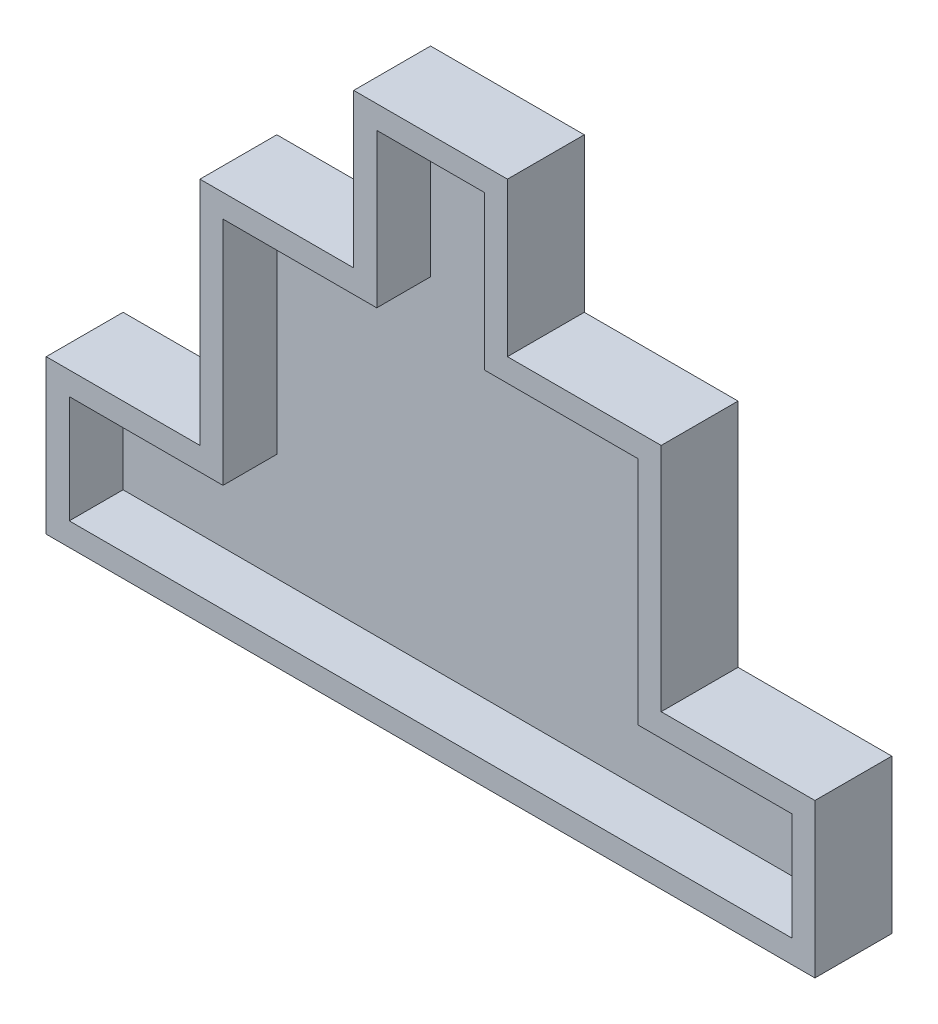
ISO-10303-21;
HEADER;
FILE_DESCRIPTION(('STEP AP214'),'2;1');
FILE_NAME('part.step','',(''),(''),'','','');
FILE_SCHEMA(('AUTOMOTIVE_DESIGN { 1 0 10303 214 1 1 1 1 }'));
ENDSEC;
DATA;
#1=APPLICATION_CONTEXT('core data for automotive mechanical design processes');
#2=APPLICATION_PROTOCOL_DEFINITION('international standard','automotive_design',2000,#1);
#3=PRODUCT_CONTEXT('',#1,'mechanical');
#4=PRODUCT('Part','Part','',(#3));
#5=PRODUCT_RELATED_PRODUCT_CATEGORY('part','',(#4));
#6=PRODUCT_DEFINITION_FORMATION('','',#4);
#7=PRODUCT_DEFINITION_CONTEXT('part definition',#1,'design');
#8=PRODUCT_DEFINITION('design','',#6,#7);
#9=PRODUCT_DEFINITION_SHAPE('','',#8);
#10=(LENGTH_UNIT() NAMED_UNIT(*) SI_UNIT(.MILLI.,.METRE.));
#11=(NAMED_UNIT(*) PLANE_ANGLE_UNIT() SI_UNIT($,.RADIAN.));
#12=(NAMED_UNIT(*) SI_UNIT($,.STERADIAN.) SOLID_ANGLE_UNIT());
#13=UNCERTAINTY_MEASURE_WITH_UNIT(LENGTH_MEASURE(1.E-05),#10,'distance_accuracy_value','');
#14=(GEOMETRIC_REPRESENTATION_CONTEXT(3) GLOBAL_UNCERTAINTY_ASSIGNED_CONTEXT((#13)) GLOBAL_UNIT_ASSIGNED_CONTEXT((#10,
#11,#12)) REPRESENTATION_CONTEXT('',''));
#15=CARTESIAN_POINT('',(0.,0.,0.));
#16=DIRECTION('',(0.,0.,1.));
#17=DIRECTION('',(1.,0.,0.));
#18=AXIS2_PLACEMENT_3D('',#15,#16,#17);
#19=CARTESIAN_POINT('',(70.5,4.49999999999999,15.));
#20=DIRECTION('',(0.,1.,0.));
#21=DIRECTION('',(0.,0.,1.));
#22=AXIS2_PLACEMENT_3D('',#19,#20,#21);
#23=PLANE('',#22);
#24=DIRECTION('',(0.,0.,-1.));
#25=VECTOR('',#24,1.);
#26=CARTESIAN_POINT('',(70.5,4.49999999999999,15.));
#27=LINE('',#26,#25);
#28=CARTESIAN_POINT('',(70.5,4.49999999999999,15.));
#29=VERTEX_POINT('',#28);
#30=CARTESIAN_POINT('',(70.5,4.49999999999999,4.5));
#31=VERTEX_POINT('',#30);
#32=EDGE_CURVE('E210',#29,#31,#27,.T.);
#33=ORIENTED_EDGE('',*,*,#32,.T.);
#34=DIRECTION('',(-1.,0.,0.));
#35=VECTOR('',#34,1.);
#36=CARTESIAN_POINT('',(70.5,4.49999999999999,4.5));
#37=LINE('',#36,#35);
#38=CARTESIAN_POINT('',(-70.5,4.49999999999999,4.5));
#39=VERTEX_POINT('',#38);
#40=EDGE_CURVE('E200',#31,#39,#37,.T.);
#41=ORIENTED_EDGE('',*,*,#40,.T.);
#42=DIRECTION('',(0.,0.,-1.));
#43=VECTOR('',#42,1.);
#44=CARTESIAN_POINT('',(-70.5,4.49999999999999,15.));
#45=LINE('',#44,#43);
#46=CARTESIAN_POINT('',(-70.5,4.49999999999999,15.));
#47=VERTEX_POINT('',#46);
#48=EDGE_CURVE('E207',#47,#39,#45,.T.);
#49=ORIENTED_EDGE('',*,*,#48,.F.);
#50=DIRECTION('',(1.,0.,0.));
#51=VECTOR('',#50,1.);
#52=CARTESIAN_POINT('',(70.5,4.49999999999999,15.));
#53=LINE('',#52,#51);
#54=EDGE_CURVE('E661',#47,#29,#53,.T.);
#55=ORIENTED_EDGE('',*,*,#54,.T.);
#56=EDGE_LOOP('',(#33,#41,#49,#55));
#57=FACE_BOUND('',#56,.T.);
#58=ADVANCED_FACE('F39',(#57),#23,.T.);
#59=CARTESIAN_POINT('',(70.5,4.49999999999999,15.));
#60=DIRECTION('',(-1.,0.,0.));
#61=DIRECTION('',(0.,0.,1.));
#62=AXIS2_PLACEMENT_3D('',#59,#60,#61);
#63=PLANE('',#62);
#64=DIRECTION('',(0.,0.,-1.));
#65=VECTOR('',#64,1.);
#66=CARTESIAN_POINT('',(70.5,25.5,15.));
#67=LINE('',#66,#65);
#68=CARTESIAN_POINT('',(70.5,25.5,15.));
#69=VERTEX_POINT('',#68);
#70=CARTESIAN_POINT('',(70.5,25.5,4.5));
#71=VERTEX_POINT('',#70);
#72=EDGE_CURVE('E245',#69,#71,#67,.T.);
#73=ORIENTED_EDGE('',*,*,#72,.T.);
#74=DIRECTION('',(0.,1.,0.));
#75=VECTOR('',#74,1.);
#76=CARTESIAN_POINT('',(70.5,4.49999999999999,4.5));
#77=LINE('',#76,#75);
#78=EDGE_CURVE('E662',#31,#71,#77,.T.);
#79=ORIENTED_EDGE('',*,*,#78,.F.);
#80=ORIENTED_EDGE('',*,*,#32,.F.);
#81=DIRECTION('',(0.,1.,0.));
#82=VECTOR('',#81,1.);
#83=CARTESIAN_POINT('',(70.5,4.49999999999999,15.));
#84=LINE('',#83,#82);
#85=EDGE_CURVE('E646',#29,#69,#84,.T.);
#86=ORIENTED_EDGE('',*,*,#85,.T.);
#87=EDGE_LOOP('',(#73,#79,#80,#86));
#88=FACE_BOUND('',#87,.T.);
#89=ADVANCED_FACE('F400',(#88),#63,.T.);
#90=CARTESIAN_POINT('',(70.5,25.5,15.));
#91=DIRECTION('',(0.,-1.,0.));
#92=DIRECTION('',(0.,0.,-1.));
#93=AXIS2_PLACEMENT_3D('',#90,#91,#92);
#94=PLANE('',#93);
#95=DIRECTION('',(0.,0.,-1.));
#96=VECTOR('',#95,1.);
#97=CARTESIAN_POINT('',(40.5,25.5,15.));
#98=LINE('',#97,#96);
#99=CARTESIAN_POINT('',(40.5,25.5,15.));
#100=VERTEX_POINT('',#99);
#101=CARTESIAN_POINT('',(40.5,25.5,4.5));
#102=VERTEX_POINT('',#101);
#103=EDGE_CURVE('E242',#100,#102,#98,.T.);
#104=ORIENTED_EDGE('',*,*,#103,.T.);
#105=DIRECTION('',(-1.,0.,0.));
#106=VECTOR('',#105,1.);
#107=CARTESIAN_POINT('',(70.5,25.5,4.5));
#108=LINE('',#107,#106);
#109=EDGE_CURVE('E631',#71,#102,#108,.T.);
#110=ORIENTED_EDGE('',*,*,#109,.F.);
#111=ORIENTED_EDGE('',*,*,#72,.F.);
#112=DIRECTION('',(-1.,0.,0.));
#113=VECTOR('',#112,1.);
#114=CARTESIAN_POINT('',(70.5,25.5,15.));
#115=LINE('',#114,#113);
#116=EDGE_CURVE('E633',#69,#100,#115,.T.);
#117=ORIENTED_EDGE('',*,*,#116,.T.);
#118=EDGE_LOOP('',(#104,#110,#111,#117));
#119=FACE_BOUND('',#118,.T.);
#120=ADVANCED_FACE('F406',(#119),#94,.T.);
#121=CARTESIAN_POINT('',(40.5,25.5,15.));
#122=DIRECTION('',(-1.,0.,0.));
#123=DIRECTION('',(0.,0.,1.));
#124=AXIS2_PLACEMENT_3D('',#121,#122,#123);
#125=PLANE('',#124);
#126=DIRECTION('',(0.,0.,-1.));
#127=VECTOR('',#126,1.);
#128=CARTESIAN_POINT('',(40.5,70.5,15.));
#129=LINE('',#128,#127);
#130=CARTESIAN_POINT('',(40.5,70.5,15.));
#131=VERTEX_POINT('',#130);
#132=CARTESIAN_POINT('',(40.5,70.5,4.5));
#133=VERTEX_POINT('',#132);
#134=EDGE_CURVE('E239',#131,#133,#129,.T.);
#135=ORIENTED_EDGE('',*,*,#134,.T.);
#136=DIRECTION('',(0.,1.,0.));
#137=VECTOR('',#136,1.);
#138=CARTESIAN_POINT('',(40.5,25.5,4.5));
#139=LINE('',#138,#137);
#140=EDGE_CURVE('E638',#102,#133,#139,.T.);
#141=ORIENTED_EDGE('',*,*,#140,.F.);
#142=ORIENTED_EDGE('',*,*,#103,.F.);
#143=DIRECTION('',(0.,1.,0.));
#144=VECTOR('',#143,1.);
#145=CARTESIAN_POINT('',(40.5,25.5,15.));
#146=LINE('',#145,#144);
#147=EDGE_CURVE('E636',#100,#131,#146,.T.);
#148=ORIENTED_EDGE('',*,*,#147,.T.);
#149=EDGE_LOOP('',(#135,#141,#142,#148));
#150=FACE_BOUND('',#149,.T.);
#151=ADVANCED_FACE('F519',(#150),#125,.T.);
#152=CARTESIAN_POINT('',(40.5,70.5,15.));
#153=DIRECTION('',(0.,-1.,0.));
#154=DIRECTION('',(0.,0.,-1.));
#155=AXIS2_PLACEMENT_3D('',#152,#153,#154);
#156=PLANE('',#155);
#157=DIRECTION('',(0.,0.,-1.));
#158=VECTOR('',#157,1.);
#159=CARTESIAN_POINT('',(10.5,70.5,15.));
#160=LINE('',#159,#158);
#161=CARTESIAN_POINT('',(10.5,70.5,15.));
#162=VERTEX_POINT('',#161);
#163=CARTESIAN_POINT('',(10.5,70.5,4.5));
#164=VERTEX_POINT('',#163);
#165=EDGE_CURVE('E236',#162,#164,#160,.T.);
#166=ORIENTED_EDGE('',*,*,#165,.T.);
#167=DIRECTION('',(-1.,0.,0.));
#168=VECTOR('',#167,1.);
#169=CARTESIAN_POINT('',(40.5,70.5,4.5));
#170=LINE('',#169,#168);
#171=EDGE_CURVE('E668',#133,#164,#170,.T.);
#172=ORIENTED_EDGE('',*,*,#171,.F.);
#173=ORIENTED_EDGE('',*,*,#134,.F.);
#174=DIRECTION('',(-1.,0.,0.));
#175=VECTOR('',#174,1.);
#176=CARTESIAN_POINT('',(40.5,70.5,15.));
#177=LINE('',#176,#175);
#178=EDGE_CURVE('E642',#131,#162,#177,.T.);
#179=ORIENTED_EDGE('',*,*,#178,.T.);
#180=EDGE_LOOP('',(#166,#172,#173,#179));
#181=FACE_BOUND('',#180,.T.);
#182=ADVANCED_FACE('F510',(#181),#156,.T.);
#183=CARTESIAN_POINT('',(10.5,70.5,15.));
#184=DIRECTION('',(-1.,0.,0.));
#185=DIRECTION('',(0.,-1.,0.));
#186=AXIS2_PLACEMENT_3D('',#183,#184,#185);
#187=PLANE('',#186);
#188=DIRECTION('',(0.,0.,-1.));
#189=VECTOR('',#188,1.);
#190=CARTESIAN_POINT('',(10.5,100.5,15.));
#191=LINE('',#190,#189);
#192=CARTESIAN_POINT('',(10.5,100.5,15.));
#193=VERTEX_POINT('',#192);
#194=CARTESIAN_POINT('',(10.5,100.5,4.5));
#195=VERTEX_POINT('',#194);
#196=EDGE_CURVE('E233',#193,#195,#191,.T.);
#197=ORIENTED_EDGE('',*,*,#196,.T.);
#198=DIRECTION('',(0.,1.,0.));
#199=VECTOR('',#198,1.);
#200=CARTESIAN_POINT('',(10.5,70.5,4.5));
#201=LINE('',#200,#199);
#202=EDGE_CURVE('E670',#164,#195,#201,.T.);
#203=ORIENTED_EDGE('',*,*,#202,.F.);
#204=ORIENTED_EDGE('',*,*,#165,.F.);
#205=DIRECTION('',(0.,1.,0.));
#206=VECTOR('',#205,1.);
#207=CARTESIAN_POINT('',(10.5,70.5,15.));
#208=LINE('',#207,#206);
#209=EDGE_CURVE('E644',#162,#193,#208,.T.);
#210=ORIENTED_EDGE('',*,*,#209,.T.);
#211=EDGE_LOOP('',(#197,#203,#204,#210));
#212=FACE_BOUND('',#211,.T.);
#213=ADVANCED_FACE('F501',(#212),#187,.T.);
#214=CARTESIAN_POINT('',(-10.5,100.5,15.));
#215=DIRECTION('',(0.,-1.,0.));
#216=DIRECTION('',(0.,0.,-1.));
#217=AXIS2_PLACEMENT_3D('',#214,#215,#216);
#218=PLANE('',#217);
#219=DIRECTION('',(0.,0.,-1.));
#220=VECTOR('',#219,1.);
#221=CARTESIAN_POINT('',(-10.5,100.5,15.));
#222=LINE('',#221,#220);
#223=CARTESIAN_POINT('',(-10.5,100.5,15.));
#224=VERTEX_POINT('',#223);
#225=CARTESIAN_POINT('',(-10.5,100.5,4.5));
#226=VERTEX_POINT('',#225);
#227=EDGE_CURVE('E230',#224,#226,#222,.T.);
#228=ORIENTED_EDGE('',*,*,#227,.T.);
#229=DIRECTION('',(1.,0.,0.));
#230=VECTOR('',#229,1.);
#231=CARTESIAN_POINT('',(-10.5,100.5,4.5));
#232=LINE('',#231,#230);
#233=EDGE_CURVE('E672',#226,#195,#232,.T.);
#234=ORIENTED_EDGE('',*,*,#233,.T.);
#235=ORIENTED_EDGE('',*,*,#196,.F.);
#236=DIRECTION('',(-1.,0.,0.));
#237=VECTOR('',#236,1.);
#238=CARTESIAN_POINT('',(-10.5,100.5,15.));
#239=LINE('',#238,#237);
#240=EDGE_CURVE('E651',#193,#224,#239,.T.);
#241=ORIENTED_EDGE('',*,*,#240,.T.);
#242=EDGE_LOOP('',(#228,#234,#235,#241));
#243=FACE_BOUND('',#242,.T.);
#244=ADVANCED_FACE('F492',(#243),#218,.T.);
#245=CARTESIAN_POINT('',(-10.5,70.5,15.));
#246=DIRECTION('',(1.,0.,0.));
#247=DIRECTION('',(0.,0.,-1.));
#248=AXIS2_PLACEMENT_3D('',#245,#246,#247);
#249=PLANE('',#248);
#250=DIRECTION('',(0.,0.,-1.));
#251=VECTOR('',#250,1.);
#252=CARTESIAN_POINT('',(-10.5,70.5,15.));
#253=LINE('',#252,#251);
#254=CARTESIAN_POINT('',(-10.5,70.5,15.));
#255=VERTEX_POINT('',#254);
#256=CARTESIAN_POINT('',(-10.5,70.5,4.5));
#257=VERTEX_POINT('',#256);
#258=EDGE_CURVE('E227',#255,#257,#253,.T.);
#259=ORIENTED_EDGE('',*,*,#258,.T.);
#260=DIRECTION('',(0.,1.,0.));
#261=VECTOR('',#260,1.);
#262=CARTESIAN_POINT('',(-10.5,70.5,4.5));
#263=LINE('',#262,#261);
#264=EDGE_CURVE('E675',#257,#226,#263,.T.);
#265=ORIENTED_EDGE('',*,*,#264,.T.);
#266=ORIENTED_EDGE('',*,*,#227,.F.);
#267=DIRECTION('',(0.,-1.,0.));
#268=VECTOR('',#267,1.);
#269=CARTESIAN_POINT('',(-10.5,70.5,15.));
#270=LINE('',#269,#268);
#271=EDGE_CURVE('E653',#224,#255,#270,.T.);
#272=ORIENTED_EDGE('',*,*,#271,.T.);
#273=EDGE_LOOP('',(#259,#265,#266,#272));
#274=FACE_BOUND('',#273,.T.);
#275=ADVANCED_FACE('F483',(#274),#249,.T.);
#276=CARTESIAN_POINT('',(-40.5,70.5,15.));
#277=DIRECTION('',(0.,-1.,0.));
#278=DIRECTION('',(0.,0.,-1.));
#279=AXIS2_PLACEMENT_3D('',#276,#277,#278);
#280=PLANE('',#279);
#281=DIRECTION('',(0.,0.,-1.));
#282=VECTOR('',#281,1.);
#283=CARTESIAN_POINT('',(-40.5,70.5,15.));
#284=LINE('',#283,#282);
#285=CARTESIAN_POINT('',(-40.5,70.5,15.));
#286=VERTEX_POINT('',#285);
#287=CARTESIAN_POINT('',(-40.5,70.5,4.5));
#288=VERTEX_POINT('',#287);
#289=EDGE_CURVE('E224',#286,#288,#284,.T.);
#290=ORIENTED_EDGE('',*,*,#289,.T.);
#291=DIRECTION('',(1.,0.,0.));
#292=VECTOR('',#291,1.);
#293=CARTESIAN_POINT('',(-40.5,70.5,4.5));
#294=LINE('',#293,#292);
#295=EDGE_CURVE('E678',#288,#257,#294,.T.);
#296=ORIENTED_EDGE('',*,*,#295,.T.);
#297=ORIENTED_EDGE('',*,*,#258,.F.);
#298=DIRECTION('',(-1.,0.,0.));
#299=VECTOR('',#298,1.);
#300=CARTESIAN_POINT('',(-40.5,70.5,15.));
#301=LINE('',#300,#299);
#302=EDGE_CURVE('E655',#255,#286,#301,.T.);
#303=ORIENTED_EDGE('',*,*,#302,.T.);
#304=EDGE_LOOP('',(#290,#296,#297,#303));
#305=FACE_BOUND('',#304,.T.);
#306=ADVANCED_FACE('F474',(#305),#280,.T.);
#307=CARTESIAN_POINT('',(-40.5,25.5,15.));
#308=DIRECTION('',(1.,0.,0.));
#309=DIRECTION('',(0.,0.,-1.));
#310=AXIS2_PLACEMENT_3D('',#307,#308,#309);
#311=PLANE('',#310);
#312=DIRECTION('',(0.,0.,-1.));
#313=VECTOR('',#312,1.);
#314=CARTESIAN_POINT('',(-40.5,25.5,15.));
#315=LINE('',#314,#313);
#316=CARTESIAN_POINT('',(-40.5,25.5,15.));
#317=VERTEX_POINT('',#316);
#318=CARTESIAN_POINT('',(-40.5,25.5,4.5));
#319=VERTEX_POINT('',#318);
#320=EDGE_CURVE('E216',#317,#319,#315,.T.);
#321=ORIENTED_EDGE('',*,*,#320,.T.);
#322=DIRECTION('',(0.,1.,0.));
#323=VECTOR('',#322,1.);
#324=CARTESIAN_POINT('',(-40.5,25.5,4.5));
#325=LINE('',#324,#323);
#326=EDGE_CURVE('E681',#319,#288,#325,.T.);
#327=ORIENTED_EDGE('',*,*,#326,.T.);
#328=ORIENTED_EDGE('',*,*,#289,.F.);
#329=DIRECTION('',(0.,-1.,0.));
#330=VECTOR('',#329,1.);
#331=CARTESIAN_POINT('',(-40.5,25.5,15.));
#332=LINE('',#331,#330);
#333=EDGE_CURVE('E657',#286,#317,#332,.T.);
#334=ORIENTED_EDGE('',*,*,#333,.T.);
#335=EDGE_LOOP('',(#321,#327,#328,#334));
#336=FACE_BOUND('',#335,.T.);
#337=ADVANCED_FACE('F465',(#336),#311,.T.);
#338=CARTESIAN_POINT('',(-70.5,25.5,15.));
#339=DIRECTION('',(0.,-1.,0.));
#340=DIRECTION('',(0.,0.,-1.));
#341=AXIS2_PLACEMENT_3D('',#338,#339,#340);
#342=PLANE('',#341);
#343=DIRECTION('',(0.,0.,-1.));
#344=VECTOR('',#343,1.);
#345=CARTESIAN_POINT('',(-70.5,25.5,15.));
#346=LINE('',#345,#344);
#347=CARTESIAN_POINT('',(-70.5,25.5,15.));
#348=VERTEX_POINT('',#347);
#349=CARTESIAN_POINT('',(-70.5,25.5,4.5));
#350=VERTEX_POINT('',#349);
#351=EDGE_CURVE('E61',#348,#350,#346,.T.);
#352=ORIENTED_EDGE('',*,*,#351,.T.);
#353=DIRECTION('',(1.,0.,0.));
#354=VECTOR('',#353,1.);
#355=CARTESIAN_POINT('',(-70.5,25.5,4.5));
#356=LINE('',#355,#354);
#357=EDGE_CURVE('E54',#350,#319,#356,.T.);
#358=ORIENTED_EDGE('',*,*,#357,.T.);
#359=ORIENTED_EDGE('',*,*,#320,.F.);
#360=DIRECTION('',(-1.,0.,0.));
#361=VECTOR('',#360,1.);
#362=CARTESIAN_POINT('',(-70.5,25.5,15.));
#363=LINE('',#362,#361);
#364=EDGE_CURVE('E218',#317,#348,#363,.T.);
#365=ORIENTED_EDGE('',*,*,#364,.T.);
#366=EDGE_LOOP('',(#352,#358,#359,#365));
#367=FACE_BOUND('',#366,.T.);
#368=ADVANCED_FACE('F457',(#367),#342,.T.);
#369=CARTESIAN_POINT('',(-70.5,4.49999999999999,15.));
#370=DIRECTION('',(1.,0.,0.));
#371=DIRECTION('',(0.,0.,-1.));
#372=AXIS2_PLACEMENT_3D('',#369,#370,#371);
#373=PLANE('',#372);
#374=ORIENTED_EDGE('',*,*,#48,.T.);
#375=DIRECTION('',(0.,1.,0.));
#376=VECTOR('',#375,1.);
#377=CARTESIAN_POINT('',(-70.5,4.49999999999999,4.5));
#378=LINE('',#377,#376);
#379=EDGE_CURVE('E197',#39,#350,#378,.T.);
#380=ORIENTED_EDGE('',*,*,#379,.T.);
#381=ORIENTED_EDGE('',*,*,#351,.F.);
#382=DIRECTION('',(0.,-1.,0.));
#383=VECTOR('',#382,1.);
#384=CARTESIAN_POINT('',(-70.5,4.49999999999999,15.));
#385=LINE('',#384,#383);
#386=EDGE_CURVE('E214',#348,#47,#385,.T.);
#387=ORIENTED_EDGE('',*,*,#386,.T.);
#388=EDGE_LOOP('',(#374,#380,#381,#387));
#389=FACE_BOUND('',#388,.T.);
#390=ADVANCED_FACE('F212',(#389),#373,.T.);
#391=CARTESIAN_POINT('',(0.,0.,15.));
#392=DIRECTION('',(0.,0.,-1.));
#393=DIRECTION('',(-1.,0.,0.));
#394=AXIS2_PLACEMENT_3D('',#391,#392,#393);
#395=PLANE('',#394);
#396=DIRECTION('',(0.,-1.,0.));
#397=VECTOR('',#396,1.);
#398=CARTESIAN_POINT('',(-75.,0.,15.));
#399=LINE('',#398,#397);
#400=CARTESIAN_POINT('',(-75.,30.,15.));
#401=VERTEX_POINT('',#400);
#402=CARTESIAN_POINT('',(-75.,0.,15.));
#403=VERTEX_POINT('',#402);
#404=EDGE_CURVE('E250',#401,#403,#399,.T.);
#405=ORIENTED_EDGE('',*,*,#404,.T.);
#406=DIRECTION('',(1.,0.,0.));
#407=VECTOR('',#406,1.);
#408=CARTESIAN_POINT('',(75.,0.,15.));
#409=LINE('',#408,#407);
#410=CARTESIAN_POINT('',(75.,0.,15.));
#411=VERTEX_POINT('',#410);
#412=EDGE_CURVE('E253',#403,#411,#409,.T.);
#413=ORIENTED_EDGE('',*,*,#412,.T.);
#414=DIRECTION('',(0.,1.,0.));
#415=VECTOR('',#414,1.);
#416=CARTESIAN_POINT('',(75.,0.,15.));
#417=LINE('',#416,#415);
#418=CARTESIAN_POINT('',(75.,30.,15.));
#419=VERTEX_POINT('',#418);
#420=EDGE_CURVE('E256',#411,#419,#417,.T.);
#421=ORIENTED_EDGE('',*,*,#420,.T.);
#422=DIRECTION('',(-1.,0.,0.));
#423=VECTOR('',#422,1.);
#424=CARTESIAN_POINT('',(75.,30.,15.));
#425=LINE('',#424,#423);
#426=CARTESIAN_POINT('',(45.,30.,15.));
#427=VERTEX_POINT('',#426);
#428=EDGE_CURVE('E258',#419,#427,#425,.T.);
#429=ORIENTED_EDGE('',*,*,#428,.T.);
#430=DIRECTION('',(0.,1.,0.));
#431=VECTOR('',#430,1.);
#432=CARTESIAN_POINT('',(45.,30.,15.));
#433=LINE('',#432,#431);
#434=CARTESIAN_POINT('',(45.,75.,15.));
#435=VERTEX_POINT('',#434);
#436=EDGE_CURVE('E260',#427,#435,#433,.T.);
#437=ORIENTED_EDGE('',*,*,#436,.T.);
#438=DIRECTION('',(-1.,0.,0.));
#439=VECTOR('',#438,1.);
#440=CARTESIAN_POINT('',(45.,75.,15.));
#441=LINE('',#440,#439);
#442=CARTESIAN_POINT('',(15.,75.,15.));
#443=VERTEX_POINT('',#442);
#444=EDGE_CURVE('E262',#435,#443,#441,.T.);
#445=ORIENTED_EDGE('',*,*,#444,.T.);
#446=DIRECTION('',(0.,1.,0.));
#447=VECTOR('',#446,1.);
#448=CARTESIAN_POINT('',(15.,75.,15.));
#449=LINE('',#448,#447);
#450=CARTESIAN_POINT('',(15.,105.,15.));
#451=VERTEX_POINT('',#450);
#452=EDGE_CURVE('E264',#443,#451,#449,.T.);
#453=ORIENTED_EDGE('',*,*,#452,.T.);
#454=DIRECTION('',(-1.,0.,0.));
#455=VECTOR('',#454,1.);
#456=CARTESIAN_POINT('',(-15.,105.,15.));
#457=LINE('',#456,#455);
#458=CARTESIAN_POINT('',(-15.,105.,15.));
#459=VERTEX_POINT('',#458);
#460=EDGE_CURVE('E266',#451,#459,#457,.T.);
#461=ORIENTED_EDGE('',*,*,#460,.T.);
#462=DIRECTION('',(0.,-1.,0.));
#463=VECTOR('',#462,1.);
#464=CARTESIAN_POINT('',(-15.,75.,15.));
#465=LINE('',#464,#463);
#466=CARTESIAN_POINT('',(-15.,75.,15.));
#467=VERTEX_POINT('',#466);
#468=EDGE_CURVE('E268',#459,#467,#465,.T.);
#469=ORIENTED_EDGE('',*,*,#468,.T.);
#470=DIRECTION('',(-1.,0.,0.));
#471=VECTOR('',#470,1.);
#472=CARTESIAN_POINT('',(-45.,75.,15.));
#473=LINE('',#472,#471);
#474=CARTESIAN_POINT('',(-45.,75.,15.));
#475=VERTEX_POINT('',#474);
#476=EDGE_CURVE('E270',#467,#475,#473,.T.);
#477=ORIENTED_EDGE('',*,*,#476,.T.);
#478=DIRECTION('',(0.,-1.,0.));
#479=VECTOR('',#478,1.);
#480=CARTESIAN_POINT('',(-45.,30.,15.));
#481=LINE('',#480,#479);
#482=CARTESIAN_POINT('',(-45.,30.,15.));
#483=VERTEX_POINT('',#482);
#484=EDGE_CURVE('E272',#475,#483,#481,.T.);
#485=ORIENTED_EDGE('',*,*,#484,.T.);
#486=DIRECTION('',(-1.,0.,0.));
#487=VECTOR('',#486,1.);
#488=CARTESIAN_POINT('',(-75.,30.,15.));
#489=LINE('',#488,#487);
#490=EDGE_CURVE('E274',#483,#401,#489,.T.);
#491=ORIENTED_EDGE('',*,*,#490,.T.);
#492=EDGE_LOOP('',(#405,#413,#421,#429,#437,#445,#453,#461,#469,#477,#485,#491));
#493=FACE_BOUND('',#492,.T.);
#494=ORIENTED_EDGE('',*,*,#54,.F.);
#495=ORIENTED_EDGE('',*,*,#386,.F.);
#496=ORIENTED_EDGE('',*,*,#364,.F.);
#497=ORIENTED_EDGE('',*,*,#333,.F.);
#498=ORIENTED_EDGE('',*,*,#302,.F.);
#499=ORIENTED_EDGE('',*,*,#271,.F.);
#500=ORIENTED_EDGE('',*,*,#240,.F.);
#501=ORIENTED_EDGE('',*,*,#209,.F.);
#502=ORIENTED_EDGE('',*,*,#178,.F.);
#503=ORIENTED_EDGE('',*,*,#147,.F.);
#504=ORIENTED_EDGE('',*,*,#116,.F.);
#505=ORIENTED_EDGE('',*,*,#85,.F.);
#506=EDGE_LOOP('',(#494,#495,#496,#497,#498,#499,#500,#501,#502,#503,#504,#505));
#507=FACE_BOUND('',#506,.T.);
#508=ADVANCED_FACE('F352',(#493,#507),#395,.F.);
#509=CARTESIAN_POINT('',(0.,0.,0.));
#510=DIRECTION('',(0.,0.,-1.));
#511=DIRECTION('',(-1.,0.,0.));
#512=AXIS2_PLACEMENT_3D('',#509,#510,#511);
#513=PLANE('',#512);
#514=DIRECTION('',(0.,-1.,0.));
#515=VECTOR('',#514,1.);
#516=CARTESIAN_POINT('',(-75.,0.,0.));
#517=LINE('',#516,#515);
#518=CARTESIAN_POINT('',(-75.,30.,0.));
#519=VERTEX_POINT('',#518);
#520=CARTESIAN_POINT('',(-75.,0.,0.));
#521=VERTEX_POINT('',#520);
#522=EDGE_CURVE('E249',#519,#521,#517,.T.);
#523=ORIENTED_EDGE('',*,*,#522,.F.);
#524=DIRECTION('',(-1.,0.,0.));
#525=VECTOR('',#524,1.);
#526=CARTESIAN_POINT('',(-75.,30.,0.));
#527=LINE('',#526,#525);
#528=CARTESIAN_POINT('',(-45.,30.,0.));
#529=VERTEX_POINT('',#528);
#530=EDGE_CURVE('E254',#529,#519,#527,.T.);
#531=ORIENTED_EDGE('',*,*,#530,.F.);
#532=DIRECTION('',(0.,-1.,0.));
#533=VECTOR('',#532,1.);
#534=CARTESIAN_POINT('',(-45.,30.,0.));
#535=LINE('',#534,#533);
#536=CARTESIAN_POINT('',(-45.,75.,0.));
#537=VERTEX_POINT('',#536);
#538=EDGE_CURVE('E297',#537,#529,#535,.T.);
#539=ORIENTED_EDGE('',*,*,#538,.F.);
#540=DIRECTION('',(-1.,0.,0.));
#541=VECTOR('',#540,1.);
#542=CARTESIAN_POINT('',(-45.,75.,0.));
#543=LINE('',#542,#541);
#544=CARTESIAN_POINT('',(-15.,75.,0.));
#545=VERTEX_POINT('',#544);
#546=EDGE_CURVE('E295',#545,#537,#543,.T.);
#547=ORIENTED_EDGE('',*,*,#546,.F.);
#548=DIRECTION('',(0.,-1.,0.));
#549=VECTOR('',#548,1.);
#550=CARTESIAN_POINT('',(-15.,75.,0.));
#551=LINE('',#550,#549);
#552=CARTESIAN_POINT('',(-15.,105.,0.));
#553=VERTEX_POINT('',#552);
#554=EDGE_CURVE('E293',#553,#545,#551,.T.);
#555=ORIENTED_EDGE('',*,*,#554,.F.);
#556=DIRECTION('',(-1.,0.,0.));
#557=VECTOR('',#556,1.);
#558=CARTESIAN_POINT('',(-15.,105.,0.));
#559=LINE('',#558,#557);
#560=CARTESIAN_POINT('',(15.,105.,0.));
#561=VERTEX_POINT('',#560);
#562=EDGE_CURVE('E291',#561,#553,#559,.T.);
#563=ORIENTED_EDGE('',*,*,#562,.F.);
#564=DIRECTION('',(0.,1.,0.));
#565=VECTOR('',#564,1.);
#566=CARTESIAN_POINT('',(15.,75.,0.));
#567=LINE('',#566,#565);
#568=CARTESIAN_POINT('',(15.,75.,0.));
#569=VERTEX_POINT('',#568);
#570=EDGE_CURVE('E289',#569,#561,#567,.T.);
#571=ORIENTED_EDGE('',*,*,#570,.F.);
#572=DIRECTION('',(-1.,0.,0.));
#573=VECTOR('',#572,1.);
#574=CARTESIAN_POINT('',(45.,75.,0.));
#575=LINE('',#574,#573);
#576=CARTESIAN_POINT('',(45.,75.,0.));
#577=VERTEX_POINT('',#576);
#578=EDGE_CURVE('E287',#577,#569,#575,.T.);
#579=ORIENTED_EDGE('',*,*,#578,.F.);
#580=DIRECTION('',(0.,1.,0.));
#581=VECTOR('',#580,1.);
#582=CARTESIAN_POINT('',(45.,30.,0.));
#583=LINE('',#582,#581);
#584=CARTESIAN_POINT('',(45.,30.,0.));
#585=VERTEX_POINT('',#584);
#586=EDGE_CURVE('E285',#585,#577,#583,.T.);
#587=ORIENTED_EDGE('',*,*,#586,.F.);
#588=DIRECTION('',(-1.,0.,0.));
#589=VECTOR('',#588,1.);
#590=CARTESIAN_POINT('',(75.,30.,0.));
#591=LINE('',#590,#589);
#592=CARTESIAN_POINT('',(75.,30.,0.));
#593=VERTEX_POINT('',#592);
#594=EDGE_CURVE('E283',#593,#585,#591,.T.);
#595=ORIENTED_EDGE('',*,*,#594,.F.);
#596=DIRECTION('',(0.,1.,0.));
#597=VECTOR('',#596,1.);
#598=CARTESIAN_POINT('',(75.,0.,0.));
#599=LINE('',#598,#597);
#600=CARTESIAN_POINT('',(75.,0.,0.));
#601=VERTEX_POINT('',#600);
#602=EDGE_CURVE('E281',#601,#593,#599,.T.);
#603=ORIENTED_EDGE('',*,*,#602,.F.);
#604=DIRECTION('',(1.,0.,0.));
#605=VECTOR('',#604,1.);
#606=CARTESIAN_POINT('',(75.,0.,0.));
#607=LINE('',#606,#605);
#608=EDGE_CURVE('E279',#521,#601,#607,.T.);
#609=ORIENTED_EDGE('',*,*,#608,.F.);
#610=EDGE_LOOP('',(#523,#531,#539,#547,#555,#563,#571,#579,#587,#595,#603,#609));
#611=FACE_BOUND('',#610,.T.);
#612=ADVANCED_FACE('F339',(#611),#513,.T.);
#613=CARTESIAN_POINT('',(-75.,0.,15.));
#614=DIRECTION('',(1.,0.,0.));
#615=DIRECTION('',(0.,0.,-1.));
#616=AXIS2_PLACEMENT_3D('',#613,#614,#615);
#617=PLANE('',#616);
#618=ORIENTED_EDGE('',*,*,#522,.T.);
#619=DIRECTION('',(0.,0.,-1.));
#620=VECTOR('',#619,1.);
#621=CARTESIAN_POINT('',(-75.,0.,15.));
#622=LINE('',#621,#620);
#623=EDGE_CURVE('E11',#403,#521,#622,.T.);
#624=ORIENTED_EDGE('',*,*,#623,.F.);
#625=ORIENTED_EDGE('',*,*,#404,.F.);
#626=DIRECTION('',(0.,0.,-1.));
#627=VECTOR('',#626,1.);
#628=CARTESIAN_POINT('',(-75.,30.,15.));
#629=LINE('',#628,#627);
#630=EDGE_CURVE('E276',#401,#519,#629,.T.);
#631=ORIENTED_EDGE('',*,*,#630,.T.);
#632=EDGE_LOOP('',(#618,#624,#625,#631));
#633=FACE_BOUND('',#632,.T.);
#634=ADVANCED_FACE('F41',(#633),#617,.F.);
#635=CARTESIAN_POINT('',(75.,0.,15.));
#636=DIRECTION('',(0.,1.,0.));
#637=DIRECTION('',(0.,0.,1.));
#638=AXIS2_PLACEMENT_3D('',#635,#636,#637);
#639=PLANE('',#638);
#640=ORIENTED_EDGE('',*,*,#608,.T.);
#641=DIRECTION('',(0.,0.,-1.));
#642=VECTOR('',#641,1.);
#643=CARTESIAN_POINT('',(75.,0.,15.));
#644=LINE('',#643,#642);
#645=EDGE_CURVE('E47',#411,#601,#644,.T.);
#646=ORIENTED_EDGE('',*,*,#645,.F.);
#647=ORIENTED_EDGE('',*,*,#412,.F.);
#648=ORIENTED_EDGE('',*,*,#623,.T.);
#649=EDGE_LOOP('',(#640,#646,#647,#648));
#650=FACE_BOUND('',#649,.T.);
#651=ADVANCED_FACE('F357',(#650),#639,.F.);
#652=CARTESIAN_POINT('',(75.,0.,15.));
#653=DIRECTION('',(-1.,0.,0.));
#654=DIRECTION('',(0.,0.,1.));
#655=AXIS2_PLACEMENT_3D('',#652,#653,#654);
#656=PLANE('',#655);
#657=ORIENTED_EDGE('',*,*,#602,.T.);
#658=DIRECTION('',(0.,0.,-1.));
#659=VECTOR('',#658,1.);
#660=CARTESIAN_POINT('',(75.,30.,15.));
#661=LINE('',#660,#659);
#662=EDGE_CURVE('E326',#419,#593,#661,.T.);
#663=ORIENTED_EDGE('',*,*,#662,.F.);
#664=ORIENTED_EDGE('',*,*,#420,.F.);
#665=ORIENTED_EDGE('',*,*,#645,.T.);
#666=EDGE_LOOP('',(#657,#663,#664,#665));
#667=FACE_BOUND('',#666,.T.);
#668=ADVANCED_FACE('F333',(#667),#656,.F.);
#669=CARTESIAN_POINT('',(75.,30.,15.));
#670=DIRECTION('',(0.,-1.,0.));
#671=DIRECTION('',(1.,0.,0.));
#672=AXIS2_PLACEMENT_3D('',#669,#670,#671);
#673=PLANE('',#672);
#674=ORIENTED_EDGE('',*,*,#594,.T.);
#675=DIRECTION('',(0.,0.,-1.));
#676=VECTOR('',#675,1.);
#677=CARTESIAN_POINT('',(45.,30.,15.));
#678=LINE('',#677,#676);
#679=EDGE_CURVE('E323',#427,#585,#678,.T.);
#680=ORIENTED_EDGE('',*,*,#679,.F.);
#681=ORIENTED_EDGE('',*,*,#428,.F.);
#682=ORIENTED_EDGE('',*,*,#662,.T.);
#683=EDGE_LOOP('',(#674,#680,#681,#682));
#684=FACE_BOUND('',#683,.T.);
#685=ADVANCED_FACE('F344',(#684),#673,.F.);
#686=CARTESIAN_POINT('',(45.,30.,15.));
#687=DIRECTION('',(-1.,0.,0.));
#688=DIRECTION('',(0.,-1.,0.));
#689=AXIS2_PLACEMENT_3D('',#686,#687,#688);
#690=PLANE('',#689);
#691=ORIENTED_EDGE('',*,*,#586,.T.);
#692=DIRECTION('',(0.,0.,-1.));
#693=VECTOR('',#692,1.);
#694=CARTESIAN_POINT('',(45.,75.,15.));
#695=LINE('',#694,#693);
#696=EDGE_CURVE('E320',#435,#577,#695,.T.);
#697=ORIENTED_EDGE('',*,*,#696,.F.);
#698=ORIENTED_EDGE('',*,*,#436,.F.);
#699=ORIENTED_EDGE('',*,*,#679,.T.);
#700=EDGE_LOOP('',(#691,#697,#698,#699));
#701=FACE_BOUND('',#700,.T.);
#702=ADVANCED_FACE('F348',(#701),#690,.F.);
#703=CARTESIAN_POINT('',(45.,75.,15.));
#704=DIRECTION('',(0.,-1.,0.));
#705=DIRECTION('',(0.,0.,-1.));
#706=AXIS2_PLACEMENT_3D('',#703,#704,#705);
#707=PLANE('',#706);
#708=ORIENTED_EDGE('',*,*,#578,.T.);
#709=DIRECTION('',(0.,0.,-1.));
#710=VECTOR('',#709,1.);
#711=CARTESIAN_POINT('',(15.,75.,15.));
#712=LINE('',#711,#710);
#713=EDGE_CURVE('E317',#443,#569,#712,.T.);
#714=ORIENTED_EDGE('',*,*,#713,.F.);
#715=ORIENTED_EDGE('',*,*,#444,.F.);
#716=ORIENTED_EDGE('',*,*,#696,.T.);
#717=EDGE_LOOP('',(#708,#714,#715,#716));
#718=FACE_BOUND('',#717,.T.);
#719=ADVANCED_FACE('F390',(#718),#707,.F.);
#720=CARTESIAN_POINT('',(15.,75.,15.));
#721=DIRECTION('',(-1.,0.,0.));
#722=DIRECTION('',(0.,0.,1.));
#723=AXIS2_PLACEMENT_3D('',#720,#721,#722);
#724=PLANE('',#723);
#725=ORIENTED_EDGE('',*,*,#570,.T.);
#726=DIRECTION('',(0.,0.,-1.));
#727=VECTOR('',#726,1.);
#728=CARTESIAN_POINT('',(15.,105.,15.));
#729=LINE('',#728,#727);
#730=EDGE_CURVE('E314',#451,#561,#729,.T.);
#731=ORIENTED_EDGE('',*,*,#730,.F.);
#732=ORIENTED_EDGE('',*,*,#452,.F.);
#733=ORIENTED_EDGE('',*,*,#713,.T.);
#734=EDGE_LOOP('',(#725,#731,#732,#733));
#735=FACE_BOUND('',#734,.T.);
#736=ADVANCED_FACE('F388',(#735),#724,.F.);
#737=CARTESIAN_POINT('',(-15.,105.,15.));
#738=DIRECTION('',(0.,-1.,0.));
#739=DIRECTION('',(0.,0.,-1.));
#740=AXIS2_PLACEMENT_3D('',#737,#738,#739);
#741=PLANE('',#740);
#742=ORIENTED_EDGE('',*,*,#562,.T.);
#743=DIRECTION('',(0.,0.,-1.));
#744=VECTOR('',#743,1.);
#745=CARTESIAN_POINT('',(-15.,105.,15.));
#746=LINE('',#745,#744);
#747=EDGE_CURVE('E311',#459,#553,#746,.T.);
#748=ORIENTED_EDGE('',*,*,#747,.F.);
#749=ORIENTED_EDGE('',*,*,#460,.F.);
#750=ORIENTED_EDGE('',*,*,#730,.T.);
#751=EDGE_LOOP('',(#742,#748,#749,#750));
#752=FACE_BOUND('',#751,.T.);
#753=ADVANCED_FACE('F384',(#752),#741,.F.);
#754=CARTESIAN_POINT('',(-15.,75.,15.));
#755=DIRECTION('',(1.,0.,0.));
#756=DIRECTION('',(0.,0.,-1.));
#757=AXIS2_PLACEMENT_3D('',#754,#755,#756);
#758=PLANE('',#757);
#759=ORIENTED_EDGE('',*,*,#554,.T.);
#760=DIRECTION('',(0.,0.,-1.));
#761=VECTOR('',#760,1.);
#762=CARTESIAN_POINT('',(-15.,75.,15.));
#763=LINE('',#762,#761);
#764=EDGE_CURVE('E308',#467,#545,#763,.T.);
#765=ORIENTED_EDGE('',*,*,#764,.F.);
#766=ORIENTED_EDGE('',*,*,#468,.F.);
#767=ORIENTED_EDGE('',*,*,#747,.T.);
#768=EDGE_LOOP('',(#759,#765,#766,#767));
#769=FACE_BOUND('',#768,.T.);
#770=ADVANCED_FACE('F379',(#769),#758,.F.);
#771=CARTESIAN_POINT('',(-45.,75.,15.));
#772=DIRECTION('',(0.,-1.,0.));
#773=DIRECTION('',(0.,0.,-1.));
#774=AXIS2_PLACEMENT_3D('',#771,#772,#773);
#775=PLANE('',#774);
#776=ORIENTED_EDGE('',*,*,#546,.T.);
#777=DIRECTION('',(0.,0.,-1.));
#778=VECTOR('',#777,1.);
#779=CARTESIAN_POINT('',(-45.,75.,15.));
#780=LINE('',#779,#778);
#781=EDGE_CURVE('E305',#475,#537,#780,.T.);
#782=ORIENTED_EDGE('',*,*,#781,.F.);
#783=ORIENTED_EDGE('',*,*,#476,.F.);
#784=ORIENTED_EDGE('',*,*,#764,.T.);
#785=EDGE_LOOP('',(#776,#782,#783,#784));
#786=FACE_BOUND('',#785,.T.);
#787=ADVANCED_FACE('F373',(#786),#775,.F.);
#788=CARTESIAN_POINT('',(-45.,30.,15.));
#789=DIRECTION('',(1.,0.,0.));
#790=DIRECTION('',(0.,1.,0.));
#791=AXIS2_PLACEMENT_3D('',#788,#789,#790);
#792=PLANE('',#791);
#793=ORIENTED_EDGE('',*,*,#538,.T.);
#794=DIRECTION('',(0.,0.,-1.));
#795=VECTOR('',#794,1.);
#796=CARTESIAN_POINT('',(-45.,30.,15.));
#797=LINE('',#796,#795);
#798=EDGE_CURVE('E302',#483,#529,#797,.T.);
#799=ORIENTED_EDGE('',*,*,#798,.F.);
#800=ORIENTED_EDGE('',*,*,#484,.F.);
#801=ORIENTED_EDGE('',*,*,#781,.T.);
#802=EDGE_LOOP('',(#793,#799,#800,#801));
#803=FACE_BOUND('',#802,.T.);
#804=ADVANCED_FACE('F369',(#803),#792,.F.);
#805=CARTESIAN_POINT('',(-75.,30.,15.));
#806=DIRECTION('',(0.,-1.,0.));
#807=DIRECTION('',(1.,0.,0.));
#808=AXIS2_PLACEMENT_3D('',#805,#806,#807);
#809=PLANE('',#808);
#810=ORIENTED_EDGE('',*,*,#530,.T.);
#811=ORIENTED_EDGE('',*,*,#630,.F.);
#812=ORIENTED_EDGE('',*,*,#490,.F.);
#813=ORIENTED_EDGE('',*,*,#798,.T.);
#814=EDGE_LOOP('',(#810,#811,#812,#813));
#815=FACE_BOUND('',#814,.T.);
#816=ADVANCED_FACE('F364',(#815),#809,.F.);
#817=CARTESIAN_POINT('',(0.,0.,4.5));
#818=DIRECTION('',(0.,0.,-1.));
#819=DIRECTION('',(-1.,0.,0.));
#820=AXIS2_PLACEMENT_3D('',#817,#818,#819);
#821=PLANE('',#820);
#822=ORIENTED_EDGE('',*,*,#40,.F.);
#823=ORIENTED_EDGE('',*,*,#78,.T.);
#824=ORIENTED_EDGE('',*,*,#109,.T.);
#825=ORIENTED_EDGE('',*,*,#140,.T.);
#826=ORIENTED_EDGE('',*,*,#171,.T.);
#827=ORIENTED_EDGE('',*,*,#202,.T.);
#828=ORIENTED_EDGE('',*,*,#233,.F.);
#829=ORIENTED_EDGE('',*,*,#264,.F.);
#830=ORIENTED_EDGE('',*,*,#295,.F.);
#831=ORIENTED_EDGE('',*,*,#326,.F.);
#832=ORIENTED_EDGE('',*,*,#357,.F.);
#833=ORIENTED_EDGE('',*,*,#379,.F.);
#834=EDGE_LOOP('',(#822,#823,#824,#825,#826,#827,#828,#829,#830,#831,#832,#833));
#835=FACE_BOUND('',#834,.T.);
#836=ADVANCED_FACE('F199',(#835),#821,.F.);
#837=CLOSED_SHELL('',(#58,#89,#120,#151,#182,#213,#244,#275,#306,#337,#368,#390,#508,#612,#634,
#651,#668,#685,#702,#719,#736,#753,#770,#787,#804,#816,#836));
#838=MANIFOLD_SOLID_BREP('B2',#837);
#839=ADVANCED_BREP_SHAPE_REPRESENTATION('',(#18,#838),#14);
#840=SHAPE_DEFINITION_REPRESENTATION(#9,#839);
ENDSEC;
END-ISO-10303-21;
